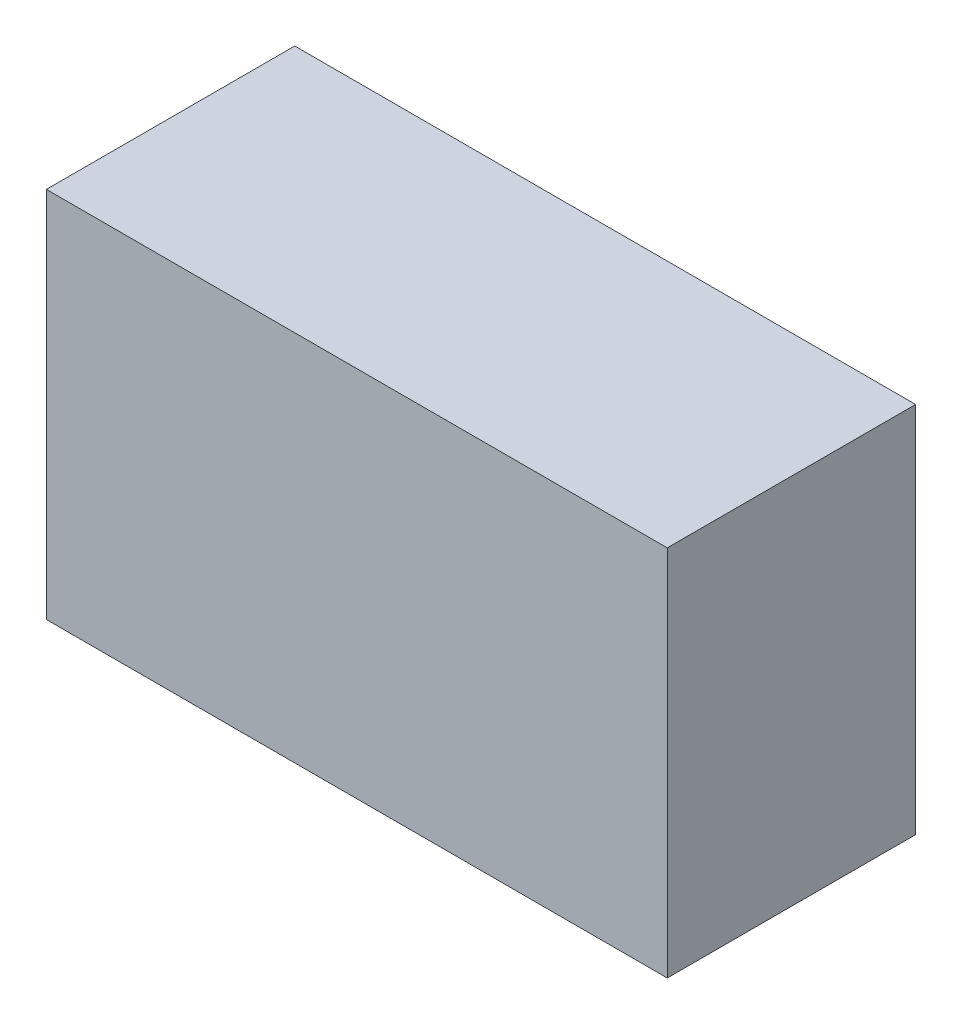
ISO-10303-21;
HEADER;
FILE_DESCRIPTION(('STEP AP214'),'2;1');
FILE_NAME('part.step','',(''),(''),'','','');
FILE_SCHEMA(('AUTOMOTIVE_DESIGN { 1 0 10303 214 1 1 1 1 }'));
ENDSEC;
DATA;
#1=APPLICATION_CONTEXT('core data for automotive mechanical design processes');
#2=APPLICATION_PROTOCOL_DEFINITION('international standard','automotive_design',2000,#1);
#3=PRODUCT_CONTEXT('',#1,'mechanical');
#4=PRODUCT('Part','Part','',(#3));
#5=PRODUCT_RELATED_PRODUCT_CATEGORY('part','',(#4));
#6=PRODUCT_DEFINITION_FORMATION('','',#4);
#7=PRODUCT_DEFINITION_CONTEXT('part definition',#1,'design');
#8=PRODUCT_DEFINITION('design','',#6,#7);
#9=PRODUCT_DEFINITION_SHAPE('','',#8);
#10=(LENGTH_UNIT() NAMED_UNIT(*) SI_UNIT(.MILLI.,.METRE.));
#11=(NAMED_UNIT(*) PLANE_ANGLE_UNIT() SI_UNIT($,.RADIAN.));
#12=(NAMED_UNIT(*) SI_UNIT($,.STERADIAN.) SOLID_ANGLE_UNIT());
#13=UNCERTAINTY_MEASURE_WITH_UNIT(LENGTH_MEASURE(1.E-05),#10,'distance_accuracy_value','');
#14=(GEOMETRIC_REPRESENTATION_CONTEXT(3) GLOBAL_UNCERTAINTY_ASSIGNED_CONTEXT((#13)) GLOBAL_UNIT_ASSIGNED_CONTEXT((#10,
#11,#12)) REPRESENTATION_CONTEXT('',''));
#15=CARTESIAN_POINT('',(0.,0.,0.));
#16=DIRECTION('',(0.,0.,1.));
#17=DIRECTION('',(1.,0.,0.));
#18=AXIS2_PLACEMENT_3D('',#15,#16,#17);
#19=CARTESIAN_POINT('',(-4.1875,11.15625,10.));
#20=DIRECTION('',(1.,0.,0.));
#21=DIRECTION('',(0.,0.,-1.));
#22=AXIS2_PLACEMENT_3D('',#19,#20,#21);
#23=PLANE('',#22);
#24=DIRECTION('',(0.,-1.,0.));
#25=VECTOR('',#24,1.);
#26=CARTESIAN_POINT('',(-4.1875,11.15625,0.));
#27=LINE('',#26,#25);
#28=CARTESIAN_POINT('',(-4.1875,11.15625,0.));
#29=VERTEX_POINT('',#28);
#30=CARTESIAN_POINT('',(-4.1875,-3.84375,0.));
#31=VERTEX_POINT('',#30);
#32=EDGE_CURVE('E96',#29,#31,#27,.T.);
#33=ORIENTED_EDGE('',*,*,#32,.T.);
#34=DIRECTION('',(0.,0.,-1.));
#35=VECTOR('',#34,1.);
#36=CARTESIAN_POINT('',(-4.1875,-3.84375,10.));
#37=LINE('',#36,#35);
#38=CARTESIAN_POINT('',(-4.1875,-3.84375,10.));
#39=VERTEX_POINT('',#38);
#40=EDGE_CURVE('E11',#39,#31,#37,.T.);
#41=ORIENTED_EDGE('',*,*,#40,.F.);
#42=DIRECTION('',(0.,-1.,0.));
#43=VECTOR('',#42,1.);
#44=CARTESIAN_POINT('',(-4.1875,11.15625,10.));
#45=LINE('',#44,#43);
#46=CARTESIAN_POINT('',(-4.1875,11.15625,10.));
#47=VERTEX_POINT('',#46);
#48=EDGE_CURVE('E84',#47,#39,#45,.T.);
#49=ORIENTED_EDGE('',*,*,#48,.F.);
#50=DIRECTION('',(0.,0.,-1.));
#51=VECTOR('',#50,1.);
#52=CARTESIAN_POINT('',(-4.1875,11.15625,10.));
#53=LINE('',#52,#51);
#54=EDGE_CURVE('E92',#47,#29,#53,.T.);
#55=ORIENTED_EDGE('',*,*,#54,.T.);
#56=EDGE_LOOP('',(#33,#41,#49,#55));
#57=FACE_BOUND('',#56,.T.);
#58=ADVANCED_FACE('F33',(#57),#23,.F.);
#59=CARTESIAN_POINT('',(-4.1875,-3.84375,10.));
#60=DIRECTION('',(0.,1.,0.));
#61=DIRECTION('',(0.,0.,1.));
#62=AXIS2_PLACEMENT_3D('',#59,#60,#61);
#63=PLANE('',#62);
#64=DIRECTION('',(1.,0.,0.));
#65=VECTOR('',#64,1.);
#66=CARTESIAN_POINT('',(-4.1875,-3.84375,0.));
#67=LINE('',#66,#65);
#68=CARTESIAN_POINT('',(20.8125,-3.84375,0.));
#69=VERTEX_POINT('',#68);
#70=EDGE_CURVE('E88',#31,#69,#67,.T.);
#71=ORIENTED_EDGE('',*,*,#70,.T.);
#72=DIRECTION('',(0.,0.,-1.));
#73=VECTOR('',#72,1.);
#74=CARTESIAN_POINT('',(20.8125,-3.84375,10.));
#75=LINE('',#74,#73);
#76=CARTESIAN_POINT('',(20.8125,-3.84375,10.));
#77=VERTEX_POINT('',#76);
#78=EDGE_CURVE('E41',#77,#69,#75,.T.);
#79=ORIENTED_EDGE('',*,*,#78,.F.);
#80=DIRECTION('',(1.,0.,0.));
#81=VECTOR('',#80,1.);
#82=CARTESIAN_POINT('',(-4.1875,-3.84375,10.));
#83=LINE('',#82,#81);
#84=EDGE_CURVE('E79',#39,#77,#83,.T.);
#85=ORIENTED_EDGE('',*,*,#84,.F.);
#86=ORIENTED_EDGE('',*,*,#40,.T.);
#87=EDGE_LOOP('',(#71,#79,#85,#86));
#88=FACE_BOUND('',#87,.T.);
#89=ADVANCED_FACE('F87',(#88),#63,.F.);
#90=CARTESIAN_POINT('',(20.8125,11.15625,10.));
#91=DIRECTION('',(-1.,0.,0.));
#92=DIRECTION('',(0.,0.,1.));
#93=AXIS2_PLACEMENT_3D('',#90,#91,#92);
#94=PLANE('',#93);
#95=DIRECTION('',(0.,1.,0.));
#96=VECTOR('',#95,1.);
#97=CARTESIAN_POINT('',(20.8125,11.15625,0.));
#98=LINE('',#97,#96);
#99=CARTESIAN_POINT('',(20.8125,11.15625,0.));
#100=VERTEX_POINT('',#99);
#101=EDGE_CURVE('E66',#69,#100,#98,.T.);
#102=ORIENTED_EDGE('',*,*,#101,.T.);
#103=DIRECTION('',(0.,0.,-1.));
#104=VECTOR('',#103,1.);
#105=CARTESIAN_POINT('',(20.8125,11.15625,10.));
#106=LINE('',#105,#104);
#107=CARTESIAN_POINT('',(20.8125,11.15625,10.));
#108=VERTEX_POINT('',#107);
#109=EDGE_CURVE('E89',#108,#100,#106,.T.);
#110=ORIENTED_EDGE('',*,*,#109,.F.);
#111=DIRECTION('',(0.,1.,0.));
#112=VECTOR('',#111,1.);
#113=CARTESIAN_POINT('',(20.8125,11.15625,10.));
#114=LINE('',#113,#112);
#115=EDGE_CURVE('E82',#77,#108,#114,.T.);
#116=ORIENTED_EDGE('',*,*,#115,.F.);
#117=ORIENTED_EDGE('',*,*,#78,.T.);
#118=EDGE_LOOP('',(#102,#110,#116,#117));
#119=FACE_BOUND('',#118,.T.);
#120=ADVANCED_FACE('F90',(#119),#94,.F.);
#121=CARTESIAN_POINT('',(-4.1875,11.15625,10.));
#122=DIRECTION('',(0.,-1.,0.));
#123=DIRECTION('',(0.,0.,-1.));
#124=AXIS2_PLACEMENT_3D('',#121,#122,#123);
#125=PLANE('',#124);
#126=DIRECTION('',(-1.,0.,0.));
#127=VECTOR('',#126,1.);
#128=CARTESIAN_POINT('',(-4.1875,11.15625,0.));
#129=LINE('',#128,#127);
#130=EDGE_CURVE('E72',#100,#29,#129,.T.);
#131=ORIENTED_EDGE('',*,*,#130,.T.);
#132=ORIENTED_EDGE('',*,*,#54,.F.);
#133=DIRECTION('',(-1.,0.,0.));
#134=VECTOR('',#133,1.);
#135=CARTESIAN_POINT('',(-4.1875,11.15625,10.));
#136=LINE('',#135,#134);
#137=EDGE_CURVE('E49',#108,#47,#136,.T.);
#138=ORIENTED_EDGE('',*,*,#137,.F.);
#139=ORIENTED_EDGE('',*,*,#109,.T.);
#140=EDGE_LOOP('',(#131,#132,#138,#139));
#141=FACE_BOUND('',#140,.T.);
#142=ADVANCED_FACE('F103',(#141),#125,.F.);
#143=CARTESIAN_POINT('',(0.,0.,10.));
#144=DIRECTION('',(0.,0.,1.));
#145=DIRECTION('',(1.,0.,0.));
#146=AXIS2_PLACEMENT_3D('',#143,#144,#145);
#147=PLANE('',#146);
#148=ORIENTED_EDGE('',*,*,#48,.T.);
#149=ORIENTED_EDGE('',*,*,#84,.T.);
#150=ORIENTED_EDGE('',*,*,#115,.T.);
#151=ORIENTED_EDGE('',*,*,#137,.T.);
#152=EDGE_LOOP('',(#148,#149,#150,#151));
#153=FACE_BOUND('',#152,.T.);
#154=ADVANCED_FACE('F80',(#153),#147,.T.);
#155=CARTESIAN_POINT('',(0.,0.,0.));
#156=DIRECTION('',(0.,0.,1.));
#157=DIRECTION('',(1.,0.,0.));
#158=AXIS2_PLACEMENT_3D('',#155,#156,#157);
#159=PLANE('',#158);
#160=ORIENTED_EDGE('',*,*,#32,.F.);
#161=ORIENTED_EDGE('',*,*,#130,.F.);
#162=ORIENTED_EDGE('',*,*,#101,.F.);
#163=ORIENTED_EDGE('',*,*,#70,.F.);
#164=EDGE_LOOP('',(#160,#161,#162,#163));
#165=FACE_BOUND('',#164,.T.);
#166=ADVANCED_FACE('F106',(#165),#159,.F.);
#167=CLOSED_SHELL('',(#58,#89,#120,#142,#154,#166));
#168=MANIFOLD_SOLID_BREP('B2',#167);
#169=ADVANCED_BREP_SHAPE_REPRESENTATION('',(#18,#168),#14);
#170=SHAPE_DEFINITION_REPRESENTATION(#9,#169);
ENDSEC;
END-ISO-10303-21;
